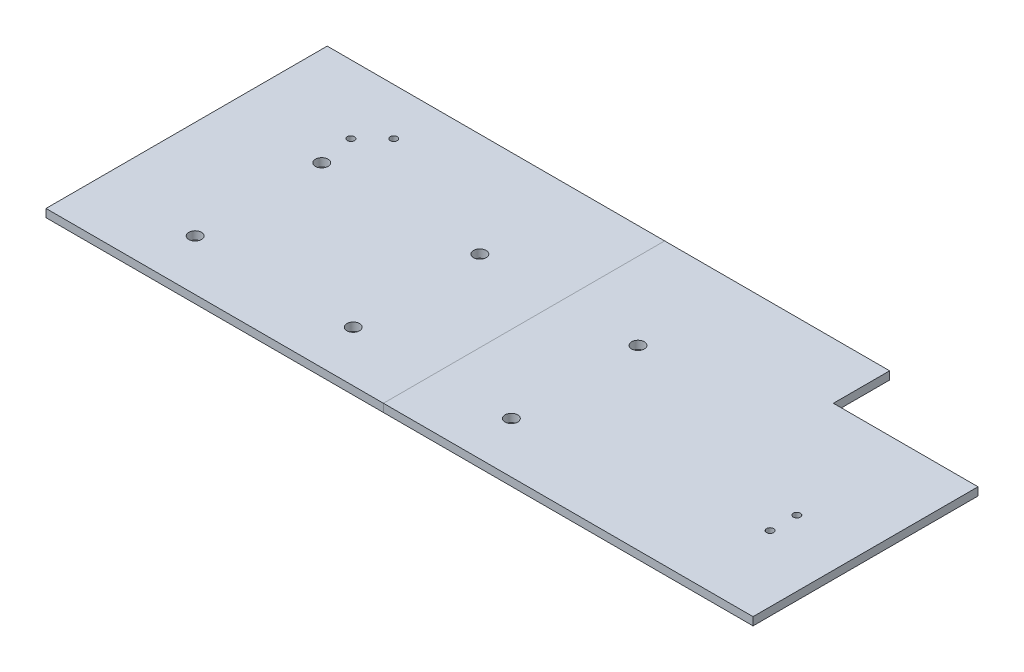
ISO-10303-21;
HEADER;
FILE_DESCRIPTION(('STEP AP214'),'2;1');
FILE_NAME('part.step','',(''),(''),'','','');
FILE_SCHEMA(('AUTOMOTIVE_DESIGN { 1 0 10303 214 1 1 1 1 }'));
ENDSEC;
DATA;
#1=APPLICATION_CONTEXT('core data for automotive mechanical design processes');
#2=APPLICATION_PROTOCOL_DEFINITION('international standard','automotive_design',2000,#1);
#3=PRODUCT_CONTEXT('',#1,'mechanical');
#4=PRODUCT('Part','Part','',(#3));
#5=PRODUCT_RELATED_PRODUCT_CATEGORY('part','',(#4));
#6=PRODUCT_DEFINITION_FORMATION('','',#4);
#7=PRODUCT_DEFINITION_CONTEXT('part definition',#1,'design');
#8=PRODUCT_DEFINITION('design','',#6,#7);
#9=PRODUCT_DEFINITION_SHAPE('','',#8);
#10=(LENGTH_UNIT() NAMED_UNIT(*) SI_UNIT(.MILLI.,.METRE.));
#11=(NAMED_UNIT(*) PLANE_ANGLE_UNIT() SI_UNIT($,.RADIAN.));
#12=(NAMED_UNIT(*) SI_UNIT($,.STERADIAN.) SOLID_ANGLE_UNIT());
#13=UNCERTAINTY_MEASURE_WITH_UNIT(LENGTH_MEASURE(1.E-05),#10,'distance_accuracy_value','');
#14=(GEOMETRIC_REPRESENTATION_CONTEXT(3) GLOBAL_UNCERTAINTY_ASSIGNED_CONTEXT((#13)) GLOBAL_UNIT_ASSIGNED_CONTEXT((#10,
#11,#12)) REPRESENTATION_CONTEXT('',''));
#15=CARTESIAN_POINT('',(0.,0.,0.));
#16=DIRECTION('',(0.,0.,1.));
#17=DIRECTION('',(1.,0.,0.));
#18=AXIS2_PLACEMENT_3D('',#15,#16,#17);
#19=CARTESIAN_POINT('',(-292.1,-0.00999999999999959,-222.25));
#20=DIRECTION('',(-1.,0.,0.));
#21=DIRECTION('',(0.,0.,1.));
#22=AXIS2_PLACEMENT_3D('',#19,#20,#21);
#23=PLANE('',#22);
#24=DIRECTION('',(0.,-1.,0.));
#25=VECTOR('',#24,1.);
#26=CARTESIAN_POINT('',(-292.1,6.35,-222.25));
#27=LINE('',#26,#25);
#28=CARTESIAN_POINT('',(-292.1,6.35,-222.25));
#29=VERTEX_POINT('',#28);
#30=CARTESIAN_POINT('',(-292.1,0.,-222.25));
#31=VERTEX_POINT('',#30);
#32=EDGE_CURVE('E128',#29,#31,#27,.T.);
#33=ORIENTED_EDGE('',*,*,#32,.T.);
#34=DIRECTION('',(0.,0.,1.));
#35=VECTOR('',#34,1.);
#36=CARTESIAN_POINT('',(-292.1,0.,0.));
#37=LINE('',#36,#35);
#38=CARTESIAN_POINT('',(-292.1,0.,0.));
#39=VERTEX_POINT('',#38);
#40=EDGE_CURVE('E116',#31,#39,#37,.T.);
#41=ORIENTED_EDGE('',*,*,#40,.T.);
#42=DIRECTION('',(0.,1.,0.));
#43=VECTOR('',#42,1.);
#44=CARTESIAN_POINT('',(-292.1,6.35,0.));
#45=LINE('',#44,#43);
#46=CARTESIAN_POINT('',(-292.1,6.35,0.));
#47=VERTEX_POINT('',#46);
#48=EDGE_CURVE('E123',#39,#47,#45,.T.);
#49=ORIENTED_EDGE('',*,*,#48,.T.);
#50=DIRECTION('',(0.,0.,1.));
#51=VECTOR('',#50,1.);
#52=CARTESIAN_POINT('',(-292.1,6.35,0.));
#53=LINE('',#52,#51);
#54=EDGE_CURVE('E127',#29,#47,#53,.T.);
#55=ORIENTED_EDGE('',*,*,#54,.F.);
#56=EDGE_LOOP('',(#33,#41,#49,#55));
#57=FACE_BOUND('',#56,.T.);
#58=ADVANCED_FACE('F50',(#57),#23,.T.);
#59=CARTESIAN_POINT('',(-558.8,6.35,0.));
#60=DIRECTION('',(0.,0.,-1.));
#61=DIRECTION('',(-1.,0.,0.));
#62=AXIS2_PLACEMENT_3D('',#59,#60,#61);
#63=PLANE('',#62);
#64=ORIENTED_EDGE('',*,*,#48,.F.);
#65=DIRECTION('',(1.,0.,0.));
#66=VECTOR('',#65,1.);
#67=CARTESIAN_POINT('',(-558.8,0.,0.));
#68=LINE('',#67,#66);
#69=CARTESIAN_POINT('',(0.,0.,0.));
#70=VERTEX_POINT('',#69);
#71=EDGE_CURVE('E54',#39,#70,#68,.T.);
#72=ORIENTED_EDGE('',*,*,#71,.T.);
#73=DIRECTION('',(0.,-1.,0.));
#74=VECTOR('',#73,1.);
#75=CARTESIAN_POINT('',(0.,6.35,0.));
#76=LINE('',#75,#74);
#77=CARTESIAN_POINT('',(0.,6.35,0.));
#78=VERTEX_POINT('',#77);
#79=EDGE_CURVE('E191',#78,#70,#76,.T.);
#80=ORIENTED_EDGE('',*,*,#79,.F.);
#81=DIRECTION('',(1.,0.,0.));
#82=VECTOR('',#81,1.);
#83=CARTESIAN_POINT('',(-558.8,6.35,0.));
#84=LINE('',#83,#82);
#85=EDGE_CURVE('E92',#47,#78,#84,.T.);
#86=ORIENTED_EDGE('',*,*,#85,.F.);
#87=EDGE_LOOP('',(#64,#72,#80,#86));
#88=FACE_BOUND('',#87,.T.);
#89=ADVANCED_FACE('F124',(#88),#63,.F.);
#90=CARTESIAN_POINT('',(-114.3,6.35,-222.25));
#91=DIRECTION('',(0.,0.,1.));
#92=DIRECTION('',(1.,0.,0.));
#93=AXIS2_PLACEMENT_3D('',#90,#91,#92);
#94=PLANE('',#93);
#95=ORIENTED_EDGE('',*,*,#32,.F.);
#96=DIRECTION('',(-1.,0.,0.));
#97=VECTOR('',#96,1.);
#98=CARTESIAN_POINT('',(-114.3,6.35,-222.25));
#99=LINE('',#98,#97);
#100=CARTESIAN_POINT('',(-114.3,6.35,-222.25));
#101=VERTEX_POINT('',#100);
#102=EDGE_CURVE('E137',#101,#29,#99,.T.);
#103=ORIENTED_EDGE('',*,*,#102,.F.);
#104=DIRECTION('',(0.,-1.,0.));
#105=VECTOR('',#104,1.);
#106=CARTESIAN_POINT('',(-114.3,6.35,-222.25));
#107=LINE('',#106,#105);
#108=CARTESIAN_POINT('',(-114.3,0.,-222.25));
#109=VERTEX_POINT('',#108);
#110=EDGE_CURVE('E142',#101,#109,#107,.T.);
#111=ORIENTED_EDGE('',*,*,#110,.T.);
#112=DIRECTION('',(-1.,0.,0.));
#113=VECTOR('',#112,1.);
#114=CARTESIAN_POINT('',(-114.3,0.,-222.25));
#115=LINE('',#114,#113);
#116=EDGE_CURVE('E144',#109,#31,#115,.T.);
#117=ORIENTED_EDGE('',*,*,#116,.T.);
#118=EDGE_LOOP('',(#95,#103,#111,#117));
#119=FACE_BOUND('',#118,.T.);
#120=ADVANCED_FACE('F205',(#119),#94,.F.);
#121=CARTESIAN_POINT('',(0.,6.35,0.));
#122=DIRECTION('',(0.,1.,0.));
#123=DIRECTION('',(0.,0.,1.));
#124=AXIS2_PLACEMENT_3D('',#121,#122,#123);
#125=PLANE('',#124);
#126=CARTESIAN_POINT('',(-231.14,6.35,-40.132));
#127=DIRECTION('',(0.,1.,0.));
#128=DIRECTION('',(0.,0.,1.));
#129=AXIS2_PLACEMENT_3D('',#126,#127,#128);
#130=CIRCLE('',#129,5.00000270000002);
#131=CARTESIAN_POINT('',(-231.14,6.35,-35.1319973));
#132=VERTEX_POINT('',#131);
#133=EDGE_CURVE('E167',#132,#132,#130,.T.);
#134=ORIENTED_EDGE('',*,*,#133,.F.);
#135=EDGE_LOOP('',(#134));
#136=FACE_BOUND('',#135,.T.);
#137=CARTESIAN_POINT('',(-231.14,6.35,-140.208));
#138=DIRECTION('',(0.,1.,0.));
#139=DIRECTION('',(0.,0.,1.));
#140=AXIS2_PLACEMENT_3D('',#137,#138,#139);
#141=CIRCLE('',#140,5.00000270000002);
#142=CARTESIAN_POINT('',(-231.14,6.35,-135.2079973));
#143=VERTEX_POINT('',#142);
#144=EDGE_CURVE('E121',#143,#143,#141,.T.);
#145=ORIENTED_EDGE('',*,*,#144,.F.);
#146=EDGE_LOOP('',(#145));
#147=FACE_BOUND('',#146,.T.);
#148=CARTESIAN_POINT('',(-52.1589,6.35,-86.7833333333333));
#149=DIRECTION('',(0.,-1.,0.));
#150=DIRECTION('',(0.,0.,-1.));
#151=AXIS2_PLACEMENT_3D('',#148,#149,#150);
#152=CIRCLE('',#151,2.778125);
#153=CARTESIAN_POINT('',(-52.1589,6.35,-89.5614583333334));
#154=VERTEX_POINT('',#153);
#155=EDGE_CURVE('E176',#154,#154,#152,.T.);
#156=ORIENTED_EDGE('',*,*,#155,.T.);
#157=EDGE_LOOP('',(#156));
#158=FACE_BOUND('',#157,.T.);
#159=CARTESIAN_POINT('',(-52.1589,6.35,-65.6166666666667));
#160=DIRECTION('',(0.,-1.,0.));
#161=DIRECTION('',(0.,0.,-1.));
#162=AXIS2_PLACEMENT_3D('',#159,#160,#161);
#163=CIRCLE('',#162,2.778125);
#164=CARTESIAN_POINT('',(-52.1589,6.35,-68.3947916666667));
#165=VERTEX_POINT('',#164);
#166=EDGE_CURVE('E61',#165,#165,#163,.T.);
#167=ORIENTED_EDGE('',*,*,#166,.T.);
#168=EDGE_LOOP('',(#167));
#169=FACE_BOUND('',#168,.T.);
#170=ORIENTED_EDGE('',*,*,#102,.T.);
#171=ORIENTED_EDGE('',*,*,#54,.T.);
#172=ORIENTED_EDGE('',*,*,#85,.T.);
#173=DIRECTION('',(0.,0.,-1.));
#174=VECTOR('',#173,1.);
#175=CARTESIAN_POINT('',(0.,6.35,0.));
#176=LINE('',#175,#174);
#177=CARTESIAN_POINT('',(0.,6.35,-177.8));
#178=VERTEX_POINT('',#177);
#179=EDGE_CURVE('E87',#78,#178,#176,.T.);
#180=ORIENTED_EDGE('',*,*,#179,.T.);
#181=DIRECTION('',(-1.,0.,0.));
#182=VECTOR('',#181,1.);
#183=CARTESIAN_POINT('',(0.,6.35,-177.8));
#184=LINE('',#183,#182);
#185=CARTESIAN_POINT('',(-114.3,6.35,-177.8));
#186=VERTEX_POINT('',#185);
#187=EDGE_CURVE('E159',#178,#186,#184,.T.);
#188=ORIENTED_EDGE('',*,*,#187,.T.);
#189=DIRECTION('',(0.,0.,-1.));
#190=VECTOR('',#189,1.);
#191=CARTESIAN_POINT('',(-114.3,6.35,-177.8));
#192=LINE('',#191,#190);
#193=EDGE_CURVE('E141',#186,#101,#192,.T.);
#194=ORIENTED_EDGE('',*,*,#193,.T.);
#195=EDGE_LOOP('',(#170,#171,#172,#180,#188,#194));
#196=FACE_BOUND('',#195,.T.);
#197=ADVANCED_FACE('F52',(#136,#147,#158,#169,#196),#125,.T.);
#198=CARTESIAN_POINT('',(0.,0.,0.));
#199=DIRECTION('',(0.,1.,0.));
#200=DIRECTION('',(0.,0.,1.));
#201=AXIS2_PLACEMENT_3D('',#198,#199,#200);
#202=PLANE('',#201);
#203=CARTESIAN_POINT('',(-231.14,0.,-40.132));
#204=DIRECTION('',(0.,1.,0.));
#205=DIRECTION('',(0.,0.,1.));
#206=AXIS2_PLACEMENT_3D('',#203,#204,#205);
#207=CIRCLE('',#206,5.00000270000002);
#208=CARTESIAN_POINT('',(-231.14,0.,-35.1319973));
#209=VERTEX_POINT('',#208);
#210=EDGE_CURVE('E171',#209,#209,#207,.T.);
#211=ORIENTED_EDGE('',*,*,#210,.T.);
#212=EDGE_LOOP('',(#211));
#213=FACE_BOUND('',#212,.T.);
#214=CARTESIAN_POINT('',(-231.14,0.,-140.208));
#215=DIRECTION('',(0.,1.,0.));
#216=DIRECTION('',(0.,0.,1.));
#217=AXIS2_PLACEMENT_3D('',#214,#215,#216);
#218=CIRCLE('',#217,5.00000270000002);
#219=CARTESIAN_POINT('',(-231.14,0.,-135.2079973));
#220=VERTEX_POINT('',#219);
#221=EDGE_CURVE('E172',#220,#220,#218,.T.);
#222=ORIENTED_EDGE('',*,*,#221,.T.);
#223=EDGE_LOOP('',(#222));
#224=FACE_BOUND('',#223,.T.);
#225=CARTESIAN_POINT('',(-52.1589,0.,-86.7833333333333));
#226=DIRECTION('',(0.,-1.,0.));
#227=DIRECTION('',(0.,0.,-1.));
#228=AXIS2_PLACEMENT_3D('',#225,#226,#227);
#229=CIRCLE('',#228,2.778125);
#230=CARTESIAN_POINT('',(-52.1589,0.,-89.5614583333334));
#231=VERTEX_POINT('',#230);
#232=EDGE_CURVE('E180',#231,#231,#229,.T.);
#233=ORIENTED_EDGE('',*,*,#232,.F.);
#234=EDGE_LOOP('',(#233));
#235=FACE_BOUND('',#234,.T.);
#236=CARTESIAN_POINT('',(-52.1589,0.,-65.6166666666667));
#237=DIRECTION('',(0.,-1.,0.));
#238=DIRECTION('',(0.,0.,-1.));
#239=AXIS2_PLACEMENT_3D('',#236,#237,#238);
#240=CIRCLE('',#239,2.778125);
#241=CARTESIAN_POINT('',(-52.1589,0.,-68.3947916666667));
#242=VERTEX_POINT('',#241);
#243=EDGE_CURVE('E12',#242,#242,#240,.T.);
#244=ORIENTED_EDGE('',*,*,#243,.F.);
#245=EDGE_LOOP('',(#244));
#246=FACE_BOUND('',#245,.T.);
#247=ORIENTED_EDGE('',*,*,#40,.F.);
#248=ORIENTED_EDGE('',*,*,#116,.F.);
#249=DIRECTION('',(0.,0.,-1.));
#250=VECTOR('',#249,1.);
#251=CARTESIAN_POINT('',(-114.3,0.,-177.8));
#252=LINE('',#251,#250);
#253=CARTESIAN_POINT('',(-114.3,0.,-177.8));
#254=VERTEX_POINT('',#253);
#255=EDGE_CURVE('E99',#254,#109,#252,.T.);
#256=ORIENTED_EDGE('',*,*,#255,.F.);
#257=DIRECTION('',(-1.,0.,0.));
#258=VECTOR('',#257,1.);
#259=CARTESIAN_POINT('',(0.,0.,-177.8));
#260=LINE('',#259,#258);
#261=CARTESIAN_POINT('',(0.,0.,-177.8));
#262=VERTEX_POINT('',#261);
#263=EDGE_CURVE('E148',#262,#254,#260,.T.);
#264=ORIENTED_EDGE('',*,*,#263,.F.);
#265=DIRECTION('',(0.,0.,-1.));
#266=VECTOR('',#265,1.);
#267=CARTESIAN_POINT('',(0.,0.,0.));
#268=LINE('',#267,#266);
#269=EDGE_CURVE('E118',#70,#262,#268,.T.);
#270=ORIENTED_EDGE('',*,*,#269,.F.);
#271=ORIENTED_EDGE('',*,*,#71,.F.);
#272=EDGE_LOOP('',(#247,#248,#256,#264,#270,#271));
#273=FACE_BOUND('',#272,.T.);
#274=ADVANCED_FACE('F113',(#213,#224,#235,#246,#273),#202,.F.);
#275=CARTESIAN_POINT('',(0.,6.35,0.));
#276=DIRECTION('',(-1.,0.,0.));
#277=DIRECTION('',(0.,0.,1.));
#278=AXIS2_PLACEMENT_3D('',#275,#276,#277);
#279=PLANE('',#278);
#280=ORIENTED_EDGE('',*,*,#269,.T.);
#281=DIRECTION('',(0.,-1.,0.));
#282=VECTOR('',#281,1.);
#283=CARTESIAN_POINT('',(0.,6.35,-177.8));
#284=LINE('',#283,#282);
#285=EDGE_CURVE('E193',#178,#262,#284,.T.);
#286=ORIENTED_EDGE('',*,*,#285,.F.);
#287=ORIENTED_EDGE('',*,*,#179,.F.);
#288=ORIENTED_EDGE('',*,*,#79,.T.);
#289=EDGE_LOOP('',(#280,#286,#287,#288));
#290=FACE_BOUND('',#289,.T.);
#291=ADVANCED_FACE('F209',(#290),#279,.F.);
#292=CARTESIAN_POINT('',(0.,6.35,-177.8));
#293=DIRECTION('',(0.,0.,1.));
#294=DIRECTION('',(1.,0.,0.));
#295=AXIS2_PLACEMENT_3D('',#292,#293,#294);
#296=PLANE('',#295);
#297=ORIENTED_EDGE('',*,*,#263,.T.);
#298=DIRECTION('',(0.,-1.,0.));
#299=VECTOR('',#298,1.);
#300=CARTESIAN_POINT('',(-114.3,6.35,-177.8));
#301=LINE('',#300,#299);
#302=EDGE_CURVE('E198',#186,#254,#301,.T.);
#303=ORIENTED_EDGE('',*,*,#302,.F.);
#304=ORIENTED_EDGE('',*,*,#187,.F.);
#305=ORIENTED_EDGE('',*,*,#285,.T.);
#306=EDGE_LOOP('',(#297,#303,#304,#305));
#307=FACE_BOUND('',#306,.T.);
#308=ADVANCED_FACE('F207',(#307),#296,.F.);
#309=CARTESIAN_POINT('',(-114.3,6.35,-177.8));
#310=DIRECTION('',(-1.,0.,0.));
#311=DIRECTION('',(0.,0.,1.));
#312=AXIS2_PLACEMENT_3D('',#309,#310,#311);
#313=PLANE('',#312);
#314=ORIENTED_EDGE('',*,*,#255,.T.);
#315=ORIENTED_EDGE('',*,*,#110,.F.);
#316=ORIENTED_EDGE('',*,*,#193,.F.);
#317=ORIENTED_EDGE('',*,*,#302,.T.);
#318=EDGE_LOOP('',(#314,#315,#316,#317));
#319=FACE_BOUND('',#318,.T.);
#320=ADVANCED_FACE('F216',(#319),#313,.F.);
#321=CARTESIAN_POINT('',(-231.14,0.,-40.132));
#322=DIRECTION('',(0.,1.,0.));
#323=DIRECTION('',(0.,0.,1.));
#324=AXIS2_PLACEMENT_3D('',#321,#322,#323);
#325=CYLINDRICAL_SURFACE('',#324,5.00000270000002);
#326=ORIENTED_EDGE('',*,*,#133,.T.);
#327=EDGE_LOOP('',(#326));
#328=FACE_BOUND('',#327,.T.);
#329=ORIENTED_EDGE('',*,*,#210,.F.);
#330=EDGE_LOOP('',(#329));
#331=FACE_BOUND('',#330,.T.);
#332=ADVANCED_FACE('F237',(#328,#331),#325,.F.);
#333=CARTESIAN_POINT('',(-231.14,0.,-140.208));
#334=DIRECTION('',(0.,1.,0.));
#335=DIRECTION('',(0.,0.,1.));
#336=AXIS2_PLACEMENT_3D('',#333,#334,#335);
#337=CYLINDRICAL_SURFACE('',#336,5.00000270000002);
#338=ORIENTED_EDGE('',*,*,#144,.T.);
#339=EDGE_LOOP('',(#338));
#340=FACE_BOUND('',#339,.T.);
#341=ORIENTED_EDGE('',*,*,#221,.F.);
#342=EDGE_LOOP('',(#341));
#343=FACE_BOUND('',#342,.T.);
#344=ADVANCED_FACE('F235',(#340,#343),#337,.F.);
#345=CARTESIAN_POINT('',(-52.1589,6.35,-86.7833333333333));
#346=DIRECTION('',(0.,-1.,0.));
#347=DIRECTION('',(0.,0.,-1.));
#348=AXIS2_PLACEMENT_3D('',#345,#346,#347);
#349=CYLINDRICAL_SURFACE('',#348,2.778125);
#350=ORIENTED_EDGE('',*,*,#155,.F.);
#351=EDGE_LOOP('',(#350));
#352=FACE_BOUND('',#351,.T.);
#353=ORIENTED_EDGE('',*,*,#232,.T.);
#354=EDGE_LOOP('',(#353));
#355=FACE_BOUND('',#354,.T.);
#356=ADVANCED_FACE('F231',(#352,#355),#349,.F.);
#357=CARTESIAN_POINT('',(-52.1589,6.35,-65.6166666666667));
#358=DIRECTION('',(0.,-1.,0.));
#359=DIRECTION('',(0.,0.,-1.));
#360=AXIS2_PLACEMENT_3D('',#357,#358,#359);
#361=CYLINDRICAL_SURFACE('',#360,2.778125);
#362=ORIENTED_EDGE('',*,*,#166,.F.);
#363=EDGE_LOOP('',(#362));
#364=FACE_BOUND('',#363,.T.);
#365=ORIENTED_EDGE('',*,*,#243,.T.);
#366=EDGE_LOOP('',(#365));
#367=FACE_BOUND('',#366,.T.);
#368=ADVANCED_FACE('F227',(#364,#367),#361,.F.);
#369=CLOSED_SHELL('',(#58,#89,#120,#197,#274,#291,#308,#320,#332,#344,#356,#368));
#370=MANIFOLD_SOLID_BREP('B2',#369);
#371=CARTESIAN_POINT('',(-292.1,-0.00999999999999959,-222.25));
#372=DIRECTION('',(-1.,0.,0.));
#373=DIRECTION('',(0.,0.,1.));
#374=AXIS2_PLACEMENT_3D('',#371,#372,#373);
#375=PLANE('',#374);
#376=DIRECTION('',(0.,-1.,0.));
#377=VECTOR('',#376,1.);
#378=CARTESIAN_POINT('',(-292.1,6.35,-222.25));
#379=LINE('',#378,#377);
#380=CARTESIAN_POINT('',(-292.1,6.35,-222.25));
#381=VERTEX_POINT('',#380);
#382=CARTESIAN_POINT('',(-292.1,0.,-222.25));
#383=VERTEX_POINT('',#382);
#384=EDGE_CURVE('E406',#381,#383,#379,.T.);
#385=ORIENTED_EDGE('',*,*,#384,.F.);
#386=DIRECTION('',(0.,0.,1.));
#387=VECTOR('',#386,1.);
#388=CARTESIAN_POINT('',(-292.1,6.35,0.));
#389=LINE('',#388,#387);
#390=CARTESIAN_POINT('',(-292.1,6.35,0.));
#391=VERTEX_POINT('',#390);
#392=EDGE_CURVE('E48',#381,#391,#389,.T.);
#393=ORIENTED_EDGE('',*,*,#392,.T.);
#394=DIRECTION('',(0.,1.,0.));
#395=VECTOR('',#394,1.);
#396=CARTESIAN_POINT('',(-292.1,6.35,0.));
#397=LINE('',#396,#395);
#398=CARTESIAN_POINT('',(-292.1,0.,0.));
#399=VERTEX_POINT('',#398);
#400=EDGE_CURVE('E338',#399,#391,#397,.T.);
#401=ORIENTED_EDGE('',*,*,#400,.F.);
#402=DIRECTION('',(0.,0.,1.));
#403=VECTOR('',#402,1.);
#404=CARTESIAN_POINT('',(-292.1,0.,0.));
#405=LINE('',#404,#403);
#406=EDGE_CURVE('E391',#383,#399,#405,.T.);
#407=ORIENTED_EDGE('',*,*,#406,.F.);
#408=EDGE_LOOP('',(#385,#393,#401,#407));
#409=FACE_BOUND('',#408,.T.);
#410=ADVANCED_FACE('F335',(#409),#375,.F.);
#411=CARTESIAN_POINT('',(-558.8,6.35,-222.25));
#412=DIRECTION('',(1.,0.,0.));
#413=DIRECTION('',(0.,0.,-1.));
#414=AXIS2_PLACEMENT_3D('',#411,#412,#413);
#415=PLANE('',#414);
#416=DIRECTION('',(0.,0.,1.));
#417=VECTOR('',#416,1.);
#418=CARTESIAN_POINT('',(-558.8,0.,-222.25));
#419=LINE('',#418,#417);
#420=CARTESIAN_POINT('',(-558.8,0.,-222.25));
#421=VERTEX_POINT('',#420);
#422=CARTESIAN_POINT('',(-558.8,0.,0.));
#423=VERTEX_POINT('',#422);
#424=EDGE_CURVE('E404',#421,#423,#419,.T.);
#425=ORIENTED_EDGE('',*,*,#424,.T.);
#426=DIRECTION('',(0.,-1.,0.));
#427=VECTOR('',#426,1.);
#428=CARTESIAN_POINT('',(-558.8,6.35,0.));
#429=LINE('',#428,#427);
#430=CARTESIAN_POINT('',(-558.8,6.35,0.));
#431=VERTEX_POINT('',#430);
#432=EDGE_CURVE('E392',#431,#423,#429,.T.);
#433=ORIENTED_EDGE('',*,*,#432,.F.);
#434=DIRECTION('',(0.,0.,1.));
#435=VECTOR('',#434,1.);
#436=CARTESIAN_POINT('',(-558.8,6.35,-222.25));
#437=LINE('',#436,#435);
#438=CARTESIAN_POINT('',(-558.8,6.35,-222.25));
#439=VERTEX_POINT('',#438);
#440=EDGE_CURVE('E378',#439,#431,#437,.T.);
#441=ORIENTED_EDGE('',*,*,#440,.F.);
#442=DIRECTION('',(0.,-1.,0.));
#443=VECTOR('',#442,1.);
#444=CARTESIAN_POINT('',(-558.8,6.35,-222.25));
#445=LINE('',#444,#443);
#446=EDGE_CURVE('E385',#439,#421,#445,.T.);
#447=ORIENTED_EDGE('',*,*,#446,.T.);
#448=EDGE_LOOP('',(#425,#433,#441,#447));
#449=FACE_BOUND('',#448,.T.);
#450=ADVANCED_FACE('F394',(#449),#415,.F.);
#451=CARTESIAN_POINT('',(-558.8,6.35,0.));
#452=DIRECTION('',(0.,0.,-1.));
#453=DIRECTION('',(-1.,0.,0.));
#454=AXIS2_PLACEMENT_3D('',#451,#452,#453);
#455=PLANE('',#454);
#456=DIRECTION('',(1.,0.,0.));
#457=VECTOR('',#456,1.);
#458=CARTESIAN_POINT('',(-558.8,0.,0.));
#459=LINE('',#458,#457);
#460=EDGE_CURVE('E400',#423,#399,#459,.T.);
#461=ORIENTED_EDGE('',*,*,#460,.T.);
#462=ORIENTED_EDGE('',*,*,#400,.T.);
#463=DIRECTION('',(1.,0.,0.));
#464=VECTOR('',#463,1.);
#465=CARTESIAN_POINT('',(-558.8,6.35,0.));
#466=LINE('',#465,#464);
#467=EDGE_CURVE('E382',#431,#391,#466,.T.);
#468=ORIENTED_EDGE('',*,*,#467,.F.);
#469=ORIENTED_EDGE('',*,*,#432,.T.);
#470=EDGE_LOOP('',(#461,#462,#468,#469));
#471=FACE_BOUND('',#470,.T.);
#472=ADVANCED_FACE('F411',(#471),#455,.F.);
#473=CARTESIAN_POINT('',(-114.3,6.35,-222.25));
#474=DIRECTION('',(0.,0.,1.));
#475=DIRECTION('',(1.,0.,0.));
#476=AXIS2_PLACEMENT_3D('',#473,#474,#475);
#477=PLANE('',#476);
#478=DIRECTION('',(-1.,0.,0.));
#479=VECTOR('',#478,1.);
#480=CARTESIAN_POINT('',(-114.3,6.35,-222.25));
#481=LINE('',#480,#479);
#482=EDGE_CURVE('E373',#381,#439,#481,.T.);
#483=ORIENTED_EDGE('',*,*,#482,.F.);
#484=ORIENTED_EDGE('',*,*,#384,.T.);
#485=DIRECTION('',(-1.,0.,0.));
#486=VECTOR('',#485,1.);
#487=CARTESIAN_POINT('',(-114.3,0.,-222.25));
#488=LINE('',#487,#486);
#489=EDGE_CURVE('E388',#383,#421,#488,.T.);
#490=ORIENTED_EDGE('',*,*,#489,.T.);
#491=ORIENTED_EDGE('',*,*,#446,.F.);
#492=EDGE_LOOP('',(#483,#484,#490,#491));
#493=FACE_BOUND('',#492,.T.);
#494=ADVANCED_FACE('F386',(#493),#477,.F.);
#495=CARTESIAN_POINT('',(-481.076,0.,-40.132));
#496=DIRECTION('',(0.,1.,0.));
#497=DIRECTION('',(0.,0.,1.));
#498=AXIS2_PLACEMENT_3D('',#495,#496,#497);
#499=CYLINDRICAL_SURFACE('',#498,5.00000270000002);
#500=CARTESIAN_POINT('',(-481.076,6.35,-40.132));
#501=DIRECTION('',(0.,1.,0.));
#502=DIRECTION('',(0.,0.,1.));
#503=AXIS2_PLACEMENT_3D('',#500,#501,#502);
#504=CIRCLE('',#503,5.00000270000002);
#505=CARTESIAN_POINT('',(-481.076,6.35,-35.1319973));
#506=VERTEX_POINT('',#505);
#507=EDGE_CURVE('E421',#506,#506,#504,.T.);
#508=ORIENTED_EDGE('',*,*,#507,.T.);
#509=EDGE_LOOP('',(#508));
#510=FACE_BOUND('',#509,.T.);
#511=CARTESIAN_POINT('',(-481.076,0.,-40.132));
#512=DIRECTION('',(0.,1.,0.));
#513=DIRECTION('',(0.,0.,1.));
#514=AXIS2_PLACEMENT_3D('',#511,#512,#513);
#515=CIRCLE('',#514,5.00000270000002);
#516=CARTESIAN_POINT('',(-481.076,0.,-35.1319973));
#517=VERTEX_POINT('',#516);
#518=EDGE_CURVE('E424',#517,#517,#515,.T.);
#519=ORIENTED_EDGE('',*,*,#518,.F.);
#520=EDGE_LOOP('',(#519));
#521=FACE_BOUND('',#520,.T.);
#522=ADVANCED_FACE('F471',(#510,#521),#499,.F.);
#523=CARTESIAN_POINT('',(-356.108,0.,-40.132));
#524=DIRECTION('',(0.,1.,0.));
#525=DIRECTION('',(0.,0.,1.));
#526=AXIS2_PLACEMENT_3D('',#523,#524,#525);
#527=CYLINDRICAL_SURFACE('',#526,5.00000270000002);
#528=CARTESIAN_POINT('',(-356.108,6.35,-40.132));
#529=DIRECTION('',(0.,1.,0.));
#530=DIRECTION('',(0.,0.,1.));
#531=AXIS2_PLACEMENT_3D('',#528,#529,#530);
#532=CIRCLE('',#531,5.00000270000002);
#533=CARTESIAN_POINT('',(-356.108,6.35,-35.1319973));
#534=VERTEX_POINT('',#533);
#535=EDGE_CURVE('E418',#534,#534,#532,.T.);
#536=ORIENTED_EDGE('',*,*,#535,.T.);
#537=EDGE_LOOP('',(#536));
#538=FACE_BOUND('',#537,.T.);
#539=CARTESIAN_POINT('',(-356.108,0.,-40.132));
#540=DIRECTION('',(0.,1.,0.));
#541=DIRECTION('',(0.,0.,1.));
#542=AXIS2_PLACEMENT_3D('',#539,#540,#541);
#543=CIRCLE('',#542,5.00000270000002);
#544=CARTESIAN_POINT('',(-356.108,0.,-35.1319973));
#545=VERTEX_POINT('',#544);
#546=EDGE_CURVE('E427',#545,#545,#543,.T.);
#547=ORIENTED_EDGE('',*,*,#546,.F.);
#548=EDGE_LOOP('',(#547));
#549=FACE_BOUND('',#548,.T.);
#550=ADVANCED_FACE('F473',(#538,#549),#527,.F.);
#551=CARTESIAN_POINT('',(-356.108,0.,-140.208));
#552=DIRECTION('',(0.,1.,0.));
#553=DIRECTION('',(0.,0.,1.));
#554=AXIS2_PLACEMENT_3D('',#551,#552,#553);
#555=CYLINDRICAL_SURFACE('',#554,5.00000270000002);
#556=CARTESIAN_POINT('',(-356.108,6.35,-140.208));
#557=DIRECTION('',(0.,1.,0.));
#558=DIRECTION('',(0.,0.,1.));
#559=AXIS2_PLACEMENT_3D('',#556,#557,#558);
#560=CIRCLE('',#559,5.00000270000002);
#561=CARTESIAN_POINT('',(-356.108,6.35,-135.2079973));
#562=VERTEX_POINT('',#561);
#563=EDGE_CURVE('E415',#562,#562,#560,.T.);
#564=ORIENTED_EDGE('',*,*,#563,.T.);
#565=EDGE_LOOP('',(#564));
#566=FACE_BOUND('',#565,.T.);
#567=CARTESIAN_POINT('',(-356.108,0.,-140.208));
#568=DIRECTION('',(0.,1.,0.));
#569=DIRECTION('',(0.,0.,1.));
#570=AXIS2_PLACEMENT_3D('',#567,#568,#569);
#571=CIRCLE('',#570,5.00000270000002);
#572=CARTESIAN_POINT('',(-356.108,0.,-135.2079973));
#573=VERTEX_POINT('',#572);
#574=EDGE_CURVE('E431',#573,#573,#571,.T.);
#575=ORIENTED_EDGE('',*,*,#574,.F.);
#576=EDGE_LOOP('',(#575));
#577=FACE_BOUND('',#576,.T.);
#578=ADVANCED_FACE('F480',(#566,#577),#555,.F.);
#579=CARTESIAN_POINT('',(-481.076,0.,-140.208));
#580=DIRECTION('',(0.,1.,0.));
#581=DIRECTION('',(0.,0.,1.));
#582=AXIS2_PLACEMENT_3D('',#579,#580,#581);
#583=CYLINDRICAL_SURFACE('',#582,5.00000270000002);
#584=CARTESIAN_POINT('',(-481.076,6.35,-140.208));
#585=DIRECTION('',(0.,1.,0.));
#586=DIRECTION('',(0.,0.,1.));
#587=AXIS2_PLACEMENT_3D('',#584,#585,#586);
#588=CIRCLE('',#587,5.00000270000002);
#589=CARTESIAN_POINT('',(-481.076,6.35,-135.2079973));
#590=VERTEX_POINT('',#589);
#591=EDGE_CURVE('E402',#590,#590,#588,.T.);
#592=ORIENTED_EDGE('',*,*,#591,.T.);
#593=EDGE_LOOP('',(#592));
#594=FACE_BOUND('',#593,.T.);
#595=CARTESIAN_POINT('',(-481.076,0.,-140.208));
#596=DIRECTION('',(0.,1.,0.));
#597=DIRECTION('',(0.,0.,1.));
#598=AXIS2_PLACEMENT_3D('',#595,#596,#597);
#599=CIRCLE('',#598,5.00000270000002);
#600=CARTESIAN_POINT('',(-481.076,0.,-135.2079973));
#601=VERTEX_POINT('',#600);
#602=EDGE_CURVE('E428',#601,#601,#599,.T.);
#603=ORIENTED_EDGE('',*,*,#602,.F.);
#604=EDGE_LOOP('',(#603));
#605=FACE_BOUND('',#604,.T.);
#606=ADVANCED_FACE('F455',(#594,#605),#583,.F.);
#607=CARTESIAN_POINT('',(-469.142233333333,6.35,-185.187166666667));
#608=DIRECTION('',(0.,-1.,0.));
#609=DIRECTION('',(0.,0.,-1.));
#610=AXIS2_PLACEMENT_3D('',#607,#608,#609);
#611=CYLINDRICAL_SURFACE('',#610,2.77812500000002);
#612=CARTESIAN_POINT('',(-469.142233333333,6.35,-185.187166666667));
#613=DIRECTION('',(0.,-1.,0.));
#614=DIRECTION('',(0.,0.,-1.));
#615=AXIS2_PLACEMENT_3D('',#612,#613,#614);
#616=CIRCLE('',#615,2.77812500000002);
#617=CARTESIAN_POINT('',(-469.142233333333,6.35,-187.965291666667));
#618=VERTEX_POINT('',#617);
#619=EDGE_CURVE('E432',#618,#618,#616,.T.);
#620=ORIENTED_EDGE('',*,*,#619,.F.);
#621=EDGE_LOOP('',(#620));
#622=FACE_BOUND('',#621,.T.);
#623=CARTESIAN_POINT('',(-469.142233333333,0.,-185.187166666667));
#624=DIRECTION('',(0.,-1.,0.));
#625=DIRECTION('',(0.,0.,-1.));
#626=AXIS2_PLACEMENT_3D('',#623,#624,#625);
#627=CIRCLE('',#626,2.77812500000002);
#628=CARTESIAN_POINT('',(-469.142233333333,0.,-187.965291666667));
#629=VERTEX_POINT('',#628);
#630=EDGE_CURVE('E443',#629,#629,#627,.T.);
#631=ORIENTED_EDGE('',*,*,#630,.T.);
#632=EDGE_LOOP('',(#631));
#633=FACE_BOUND('',#632,.T.);
#634=ADVANCED_FACE('F451',(#622,#633),#611,.F.);
#635=CARTESIAN_POINT('',(-486.075566666667,6.35,-168.253833333333));
#636=DIRECTION('',(0.,-1.,0.));
#637=DIRECTION('',(0.,0.,-1.));
#638=AXIS2_PLACEMENT_3D('',#635,#636,#637);
#639=CYLINDRICAL_SURFACE('',#638,2.77812500000002);
#640=CARTESIAN_POINT('',(-486.075566666667,6.35,-168.253833333333));
#641=DIRECTION('',(0.,-1.,0.));
#642=DIRECTION('',(0.,0.,-1.));
#643=AXIS2_PLACEMENT_3D('',#640,#641,#642);
#644=CIRCLE('',#643,2.77812500000002);
#645=CARTESIAN_POINT('',(-486.075566666667,6.35,-171.031958333333));
#646=VERTEX_POINT('',#645);
#647=EDGE_CURVE('E440',#646,#646,#644,.T.);
#648=ORIENTED_EDGE('',*,*,#647,.F.);
#649=EDGE_LOOP('',(#648));
#650=FACE_BOUND('',#649,.T.);
#651=CARTESIAN_POINT('',(-486.075566666667,0.,-168.253833333333));
#652=DIRECTION('',(0.,-1.,0.));
#653=DIRECTION('',(0.,0.,-1.));
#654=AXIS2_PLACEMENT_3D('',#651,#652,#653);
#655=CIRCLE('',#654,2.77812500000002);
#656=CARTESIAN_POINT('',(-486.075566666667,0.,-171.031958333333));
#657=VERTEX_POINT('',#656);
#658=EDGE_CURVE('E437',#657,#657,#655,.T.);
#659=ORIENTED_EDGE('',*,*,#658,.T.);
#660=EDGE_LOOP('',(#659));
#661=FACE_BOUND('',#660,.T.);
#662=ADVANCED_FACE('F454',(#650,#661),#639,.F.);
#663=CARTESIAN_POINT('',(0.,0.,0.));
#664=DIRECTION('',(0.,1.,0.));
#665=DIRECTION('',(0.,0.,1.));
#666=AXIS2_PLACEMENT_3D('',#663,#664,#665);
#667=PLANE('',#666);
#668=ORIENTED_EDGE('',*,*,#658,.F.);
#669=EDGE_LOOP('',(#668));
#670=FACE_BOUND('',#669,.T.);
#671=ORIENTED_EDGE('',*,*,#630,.F.);
#672=EDGE_LOOP('',(#671));
#673=FACE_BOUND('',#672,.T.);
#674=ORIENTED_EDGE('',*,*,#602,.T.);
#675=EDGE_LOOP('',(#674));
#676=FACE_BOUND('',#675,.T.);
#677=ORIENTED_EDGE('',*,*,#574,.T.);
#678=EDGE_LOOP('',(#677));
#679=FACE_BOUND('',#678,.T.);
#680=ORIENTED_EDGE('',*,*,#546,.T.);
#681=EDGE_LOOP('',(#680));
#682=FACE_BOUND('',#681,.T.);
#683=ORIENTED_EDGE('',*,*,#518,.T.);
#684=EDGE_LOOP('',(#683));
#685=FACE_BOUND('',#684,.T.);
#686=ORIENTED_EDGE('',*,*,#489,.F.);
#687=ORIENTED_EDGE('',*,*,#406,.T.);
#688=ORIENTED_EDGE('',*,*,#460,.F.);
#689=ORIENTED_EDGE('',*,*,#424,.F.);
#690=EDGE_LOOP('',(#686,#687,#688,#689));
#691=FACE_BOUND('',#690,.T.);
#692=ADVANCED_FACE('F409',(#670,#673,#676,#679,#682,#685,#691),#667,.F.);
#693=CARTESIAN_POINT('',(0.,6.35,0.));
#694=DIRECTION('',(0.,1.,0.));
#695=DIRECTION('',(0.,0.,1.));
#696=AXIS2_PLACEMENT_3D('',#693,#694,#695);
#697=PLANE('',#696);
#698=ORIENTED_EDGE('',*,*,#392,.F.);
#699=ORIENTED_EDGE('',*,*,#482,.T.);
#700=ORIENTED_EDGE('',*,*,#440,.T.);
#701=ORIENTED_EDGE('',*,*,#467,.T.);
#702=EDGE_LOOP('',(#698,#699,#700,#701));
#703=FACE_BOUND('',#702,.T.);
#704=ORIENTED_EDGE('',*,*,#647,.T.);
#705=EDGE_LOOP('',(#704));
#706=FACE_BOUND('',#705,.T.);
#707=ORIENTED_EDGE('',*,*,#619,.T.);
#708=EDGE_LOOP('',(#707));
#709=FACE_BOUND('',#708,.T.);
#710=ORIENTED_EDGE('',*,*,#591,.F.);
#711=EDGE_LOOP('',(#710));
#712=FACE_BOUND('',#711,.T.);
#713=ORIENTED_EDGE('',*,*,#563,.F.);
#714=EDGE_LOOP('',(#713));
#715=FACE_BOUND('',#714,.T.);
#716=ORIENTED_EDGE('',*,*,#535,.F.);
#717=EDGE_LOOP('',(#716));
#718=FACE_BOUND('',#717,.T.);
#719=ORIENTED_EDGE('',*,*,#507,.F.);
#720=EDGE_LOOP('',(#719));
#721=FACE_BOUND('',#720,.T.);
#722=ADVANCED_FACE('F375',(#703,#706,#709,#712,#715,#718,#721),#697,.T.);
#723=CLOSED_SHELL('',(#410,#450,#472,#494,#522,#550,#578,#606,#634,#662,#692,#722));
#724=MANIFOLD_SOLID_BREP('B6',#723);
#725=ADVANCED_BREP_SHAPE_REPRESENTATION('',(#18,#370,#724),#14);
#726=SHAPE_DEFINITION_REPRESENTATION(#9,#725);
ENDSEC;
END-ISO-10303-21;
